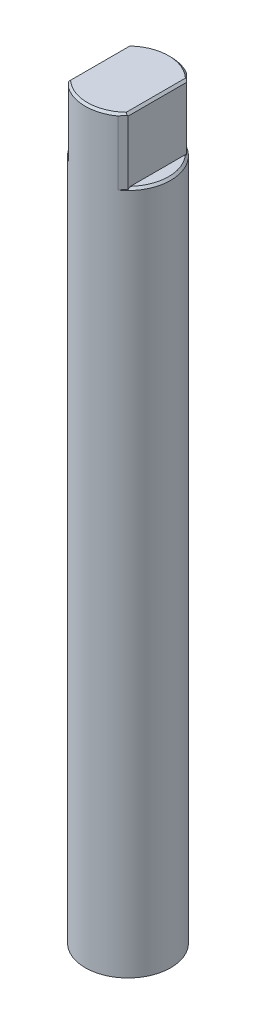
ISO-10303-21;
HEADER;
FILE_DESCRIPTION(('STEP AP214'),'2;1');
FILE_NAME('part.step','',(''),(''),'','','');
FILE_SCHEMA(('AUTOMOTIVE_DESIGN { 1 0 10303 214 1 1 1 1 }'));
ENDSEC;
DATA;
#1=APPLICATION_CONTEXT('core data for automotive mechanical design processes');
#2=APPLICATION_PROTOCOL_DEFINITION('international standard','automotive_design',2000,#1);
#3=PRODUCT_CONTEXT('',#1,'mechanical');
#4=PRODUCT('Part','Part','',(#3));
#5=PRODUCT_RELATED_PRODUCT_CATEGORY('part','',(#4));
#6=PRODUCT_DEFINITION_FORMATION('','',#4);
#7=PRODUCT_DEFINITION_CONTEXT('part definition',#1,'design');
#8=PRODUCT_DEFINITION('design','',#6,#7);
#9=PRODUCT_DEFINITION_SHAPE('','',#8);
#10=(LENGTH_UNIT() NAMED_UNIT(*) SI_UNIT(.MILLI.,.METRE.));
#11=(NAMED_UNIT(*) PLANE_ANGLE_UNIT() SI_UNIT($,.RADIAN.));
#12=(NAMED_UNIT(*) SI_UNIT($,.STERADIAN.) SOLID_ANGLE_UNIT());
#13=UNCERTAINTY_MEASURE_WITH_UNIT(LENGTH_MEASURE(1.E-05),#10,'distance_accuracy_value','');
#14=(GEOMETRIC_REPRESENTATION_CONTEXT(3) GLOBAL_UNCERTAINTY_ASSIGNED_CONTEXT((#13)) GLOBAL_UNIT_ASSIGNED_CONTEXT((#10,
#11,#12)) REPRESENTATION_CONTEXT('',''));
#15=CARTESIAN_POINT('',(0.,0.,0.));
#16=DIRECTION('',(0.,0.,1.));
#17=DIRECTION('',(1.,0.,0.));
#18=AXIS2_PLACEMENT_3D('',#15,#16,#17);
#19=CARTESIAN_POINT('',(0.,175.,0.));
#20=DIRECTION('',(0.,-1.,0.));
#21=DIRECTION('',(0.,0.,-1.));
#22=AXIS2_PLACEMENT_3D('',#19,#20,#21);
#23=CYLINDRICAL_SURFACE('',#22,10.);
#24=DIRECTION('',(0.,-1.,0.));
#25=VECTOR('',#24,1.);
#26=CARTESIAN_POINT('',(-5.78364077806194,175.,8.15778765048092));
#27=LINE('',#26,#25);
#28=CARTESIAN_POINT('',(-5.78364077806194,174.5,8.15778765048092));
#29=VERTEX_POINT('',#28);
#30=CARTESIAN_POINT('',(-5.78364077806194,159.5,8.15778765048092));
#31=VERTEX_POINT('',#30);
#32=EDGE_CURVE('E470',#29,#31,#27,.T.);
#33=ORIENTED_EDGE('',*,*,#32,.T.);
#34=CARTESIAN_POINT('',(0.,159.5,0.));
#35=DIRECTION('',(0.,1.,0.));
#36=DIRECTION('',(0.,0.,1.));
#37=AXIS2_PLACEMENT_3D('',#34,#35,#36);
#38=CIRCLE('',#37,10.);
#39=CARTESIAN_POINT('',(-4.95581271359216,159.5,-8.68561571495068));
#40=VERTEX_POINT('',#39);
#41=EDGE_CURVE('E348',#31,#40,#38,.F.);
#42=ORIENTED_EDGE('',*,*,#41,.T.);
#43=DIRECTION('',(0.,-1.,0.));
#44=VECTOR('',#43,1.);
#45=CARTESIAN_POINT('',(-4.95581271359216,175.,-8.68561571495068));
#46=LINE('',#45,#44);
#47=CARTESIAN_POINT('',(-4.95581271359216,174.5,-8.68561571495068));
#48=VERTEX_POINT('',#47);
#49=EDGE_CURVE('E379',#40,#48,#46,.F.);
#50=ORIENTED_EDGE('',*,*,#49,.T.);
#51=CARTESIAN_POINT('',(0.,174.5,0.));
#52=DIRECTION('',(0.,1.,0.));
#53=DIRECTION('',(0.,0.,1.));
#54=AXIS2_PLACEMENT_3D('',#51,#52,#53);
#55=CIRCLE('',#54,10.);
#56=CARTESIAN_POINT('',(4.95581271359219,174.5,-8.68561571495067));
#57=VERTEX_POINT('',#56);
#58=EDGE_CURVE('E216',#48,#57,#55,.F.);
#59=ORIENTED_EDGE('',*,*,#58,.T.);
#60=DIRECTION('',(0.,-1.,0.));
#61=VECTOR('',#60,1.);
#62=CARTESIAN_POINT('',(4.95581271359219,175.,-8.68561571495066));
#63=LINE('',#62,#61);
#64=CARTESIAN_POINT('',(4.95581271359219,159.5,-8.68561571495066));
#65=VERTEX_POINT('',#64);
#66=EDGE_CURVE('E378',#57,#65,#63,.T.);
#67=ORIENTED_EDGE('',*,*,#66,.T.);
#68=CARTESIAN_POINT('',(0.,159.5,0.));
#69=DIRECTION('',(0.,-1.,0.));
#70=DIRECTION('',(0.,0.,-1.));
#71=AXIS2_PLACEMENT_3D('',#68,#69,#70);
#72=CIRCLE('',#71,10.);
#73=CARTESIAN_POINT('',(5.78364077806188,159.5,8.15778765048096));
#74=VERTEX_POINT('',#73);
#75=EDGE_CURVE('E352',#65,#74,#72,.T.);
#76=ORIENTED_EDGE('',*,*,#75,.T.);
#77=DIRECTION('',(0.,-1.,0.));
#78=VECTOR('',#77,1.);
#79=CARTESIAN_POINT('',(5.78364077806188,175.,8.15778765048096));
#80=LINE('',#79,#78);
#81=CARTESIAN_POINT('',(5.78364077806188,174.5,8.15778765048096));
#82=VERTEX_POINT('',#81);
#83=EDGE_CURVE('E227',#74,#82,#80,.F.);
#84=ORIENTED_EDGE('',*,*,#83,.T.);
#85=CARTESIAN_POINT('',(0.,174.5,0.));
#86=DIRECTION('',(0.,1.,0.));
#87=DIRECTION('',(0.,0.,1.));
#88=AXIS2_PLACEMENT_3D('',#85,#86,#87);
#89=CIRCLE('',#88,10.);
#90=EDGE_CURVE('E212',#82,#29,#89,.F.);
#91=ORIENTED_EDGE('',*,*,#90,.T.);
#92=EDGE_LOOP('',(#33,#42,#50,#59,#67,#76,#84,#91));
#93=FACE_BOUND('',#92,.T.);
#94=CARTESIAN_POINT('',(0.,0.,0.));
#95=DIRECTION('',(0.,1.,0.));
#96=DIRECTION('',(0.,0.,1.));
#97=AXIS2_PLACEMENT_3D('',#94,#95,#96);
#98=CIRCLE('',#97,10.);
#99=CARTESIAN_POINT('',(0.,0.,10.));
#100=VERTEX_POINT('',#99);
#101=EDGE_CURVE('E193',#100,#100,#98,.T.);
#102=ORIENTED_EDGE('',*,*,#101,.T.);
#103=EDGE_LOOP('',(#102));
#104=FACE_BOUND('',#103,.T.);
#105=ADVANCED_FACE('F58',(#93,#104),#23,.T.);
#106=CARTESIAN_POINT('',(0.,175.,0.));
#107=DIRECTION('',(0.,1.,0.));
#108=DIRECTION('',(0.,0.,1.));
#109=AXIS2_PLACEMENT_3D('',#106,#107,#108);
#110=PLANE('',#109);
#111=DIRECTION('',(0.,0.,-1.));
#112=VECTOR('',#111,1.);
#113=CARTESIAN_POINT('',(6.50000000000003,175.,-7.14142842854285));
#114=LINE('',#113,#112);
#115=CARTESIAN_POINT('',(6.50000000000003,175.,6.92820323027552));
#116=VERTEX_POINT('',#115);
#117=CARTESIAN_POINT('',(6.50000000000003,175.,-6.92820323027552));
#118=VERTEX_POINT('',#117);
#119=EDGE_CURVE('E198',#116,#118,#114,.T.);
#120=ORIENTED_EDGE('',*,*,#119,.T.);
#121=CARTESIAN_POINT('',(0.,175.,0.));
#122=DIRECTION('',(0.,1.,0.));
#123=DIRECTION('',(0.,0.,1.));
#124=AXIS2_PLACEMENT_3D('',#121,#122,#123);
#125=CIRCLE('',#124,9.50000000000003);
#126=CARTESIAN_POINT('',(-6.50000000000003,175.,-6.92820323027552));
#127=VERTEX_POINT('',#126);
#128=EDGE_CURVE('E208',#118,#127,#125,.T.);
#129=ORIENTED_EDGE('',*,*,#128,.T.);
#130=DIRECTION('',(0.,0.,1.));
#131=VECTOR('',#130,1.);
#132=CARTESIAN_POINT('',(-6.50000000000003,175.,7.14142842854285));
#133=LINE('',#132,#131);
#134=CARTESIAN_POINT('',(-6.50000000000002,175.,6.92820323027552));
#135=VERTEX_POINT('',#134);
#136=EDGE_CURVE('E204',#127,#135,#133,.T.);
#137=ORIENTED_EDGE('',*,*,#136,.T.);
#138=CARTESIAN_POINT('',(0.,175.,0.));
#139=DIRECTION('',(0.,1.,0.));
#140=DIRECTION('',(0.,0.,1.));
#141=AXIS2_PLACEMENT_3D('',#138,#139,#140);
#142=CIRCLE('',#141,9.50000000000003);
#143=EDGE_CURVE('E201',#135,#116,#142,.T.);
#144=ORIENTED_EDGE('',*,*,#143,.T.);
#145=EDGE_LOOP('',(#120,#129,#137,#144));
#146=FACE_BOUND('',#145,.T.);
#147=ADVANCED_FACE('F429',(#146),#110,.T.);
#148=CARTESIAN_POINT('',(0.,0.,0.));
#149=DIRECTION('',(0.,1.,0.));
#150=DIRECTION('',(0.,0.,1.));
#151=AXIS2_PLACEMENT_3D('',#148,#149,#150);
#152=PLANE('',#151);
#153=CARTESIAN_POINT('',(0.,0.,0.));
#154=DIRECTION('',(0.,-1.,0.));
#155=DIRECTION('',(0.,0.,-1.));
#156=AXIS2_PLACEMENT_3D('',#153,#154,#155);
#157=CIRCLE('',#156,3.39999999999999);
#158=CARTESIAN_POINT('',(0.,0.,-3.39999999999999));
#159=VERTEX_POINT('',#158);
#160=EDGE_CURVE('E180',#159,#159,#157,.T.);
#161=ORIENTED_EDGE('',*,*,#160,.F.);
#162=EDGE_LOOP('',(#161));
#163=FACE_BOUND('',#162,.T.);
#164=ORIENTED_EDGE('',*,*,#101,.F.);
#165=EDGE_LOOP('',(#164));
#166=FACE_BOUND('',#165,.T.);
#167=ADVANCED_FACE('F434',(#163,#166),#152,.F.);
#168=CARTESIAN_POINT('',(0.,160.,0.));
#169=DIRECTION('',(0.,-1.,0.));
#170=DIRECTION('',(0.,0.,-1.));
#171=AXIS2_PLACEMENT_3D('',#168,#169,#170);
#172=PLANE('',#171);
#173=DIRECTION('',(0.,0.,1.));
#174=VECTOR('',#173,1.);
#175=CARTESIAN_POINT('',(7.,160.,-13.4465715280201));
#176=LINE('',#175,#174);
#177=CARTESIAN_POINT('',(7.,160.,-6.42261628933256));
#178=VERTEX_POINT('',#177);
#179=CARTESIAN_POINT('',(7.,160.,6.42261628933256));
#180=VERTEX_POINT('',#179);
#181=EDGE_CURVE('E179',#178,#180,#176,.T.);
#182=ORIENTED_EDGE('',*,*,#181,.T.);
#183=CARTESIAN_POINT('',(0.,160.,0.));
#184=DIRECTION('',(0.,-1.,0.));
#185=DIRECTION('',(0.,0.,-1.));
#186=AXIS2_PLACEMENT_3D('',#183,#184,#185);
#187=CIRCLE('',#186,9.5);
#188=EDGE_CURVE('E345',#180,#178,#187,.F.);
#189=ORIENTED_EDGE('',*,*,#188,.T.);
#190=EDGE_LOOP('',(#182,#189));
#191=FACE_BOUND('',#190,.T.);
#192=ADVANCED_FACE('F439',(#191),#172,.F.);
#193=CARTESIAN_POINT('',(7.,160.,-13.4465715280201));
#194=DIRECTION('',(-1.,0.,0.));
#195=DIRECTION('',(0.,0.,1.));
#196=AXIS2_PLACEMENT_3D('',#193,#194,#195);
#197=PLANE('',#196);
#198=ORIENTED_EDGE('',*,*,#181,.F.);
#199=CARTESIAN_POINT('',(7.,160.,-6.42261628933256));
#200=CARTESIAN_POINT('',(7.,159.975272298558,-6.45918868820734));
#201=CARTESIAN_POINT('',(7.,159.950468589682,-6.49570923319464));
#202=CARTESIAN_POINT('',(7.,159.900709158746,-6.56864661292437));
#203=CARTESIAN_POINT('',(7.,159.875753436697,-6.60506344767382));
#204=CARTESIAN_POINT('',(7.,159.850721707223,-6.64142842854282));
#205=B_SPLINE_CURVE_WITH_KNOTS('',3,(#199,#200,#201,#202,#203,#204),.UNSPECIFIED.,.F.,.F.,(4,2,
4),(0.,0.132441563044288,0.264883117118745),.UNSPECIFIED.);
#206=CARTESIAN_POINT('',(7.,159.850721707223,-6.64142842854282));
#207=VERTEX_POINT('',#206);
#208=EDGE_CURVE('E74',#178,#207,#205,.T.);
#209=ORIENTED_EDGE('',*,*,#208,.T.);
#210=DIRECTION('',(0.,1.,0.));
#211=VECTOR('',#210,1.);
#212=CARTESIAN_POINT('',(7.,160.,-6.64142842854282));
#213=LINE('',#212,#211);
#214=CARTESIAN_POINT('',(7.,174.5,-6.64142842854282));
#215=VERTEX_POINT('',#214);
#216=EDGE_CURVE('E80',#207,#215,#213,.T.);
#217=ORIENTED_EDGE('',*,*,#216,.T.);
#218=DIRECTION('',(0.,0.,1.));
#219=VECTOR('',#218,1.);
#220=CARTESIAN_POINT('',(7.,174.5,7.14142842854285));
#221=LINE('',#220,#219);
#222=CARTESIAN_POINT('',(7.,174.5,6.94142842854284));
#223=VERTEX_POINT('',#222);
#224=EDGE_CURVE('E224',#215,#223,#221,.T.);
#225=ORIENTED_EDGE('',*,*,#224,.T.);
#226=DIRECTION('',(0.,-1.,0.));
#227=VECTOR('',#226,1.);
#228=CARTESIAN_POINT('',(7.,160.,6.94142842854284));
#229=LINE('',#228,#227);
#230=CARTESIAN_POINT('',(7.,159.641834418687,6.94142842854284));
#231=VERTEX_POINT('',#230);
#232=EDGE_CURVE('E88',#223,#231,#229,.T.);
#233=ORIENTED_EDGE('',*,*,#232,.T.);
#234=CARTESIAN_POINT('',(7.,159.641834418687,6.94142842854284));
#235=CARTESIAN_POINT('',(7.,159.702350130539,6.85552688455556));
#236=CARTESIAN_POINT('',(7.,159.76245510595,6.76934178579844));
#237=CARTESIAN_POINT('',(7.,159.88184363374,6.59640440653526));
#238=CARTESIAN_POINT('',(7.,159.941127185433,6.50965212555563));
#239=CARTESIAN_POINT('',(7.,160.,6.42261628933256));
#240=B_SPLINE_CURVE_WITH_KNOTS('',3,(#234,#235,#236,#237,#238,#239),.UNSPECIFIED.,.F.,.F.,(4,2,
4),(0.,0.315221055534513,0.630442374307507),.UNSPECIFIED.);
#241=EDGE_CURVE('E453',#231,#180,#240,.T.);
#242=ORIENTED_EDGE('',*,*,#241,.T.);
#243=EDGE_LOOP('',(#198,#209,#217,#225,#233,#242));
#244=FACE_BOUND('',#243,.T.);
#245=ADVANCED_FACE('F333',(#244),#197,.F.);
#246=CARTESIAN_POINT('',(0.,160.,0.));
#247=DIRECTION('',(0.,1.,0.));
#248=DIRECTION('',(0.,0.,1.));
#249=AXIS2_PLACEMENT_3D('',#246,#247,#248);
#250=PLANE('',#249);
#251=DIRECTION('',(0.,0.,-1.));
#252=VECTOR('',#251,1.);
#253=CARTESIAN_POINT('',(-7.,160.,-13.4465715280201));
#254=LINE('',#253,#252);
#255=CARTESIAN_POINT('',(-7.,160.,6.42261628933252));
#256=VERTEX_POINT('',#255);
#257=CARTESIAN_POINT('',(-7.,160.,-6.42261628933252));
#258=VERTEX_POINT('',#257);
#259=EDGE_CURVE('E185',#256,#258,#254,.T.);
#260=ORIENTED_EDGE('',*,*,#259,.T.);
#261=CARTESIAN_POINT('',(0.,160.,0.));
#262=DIRECTION('',(0.,1.,0.));
#263=DIRECTION('',(0.,0.,1.));
#264=AXIS2_PLACEMENT_3D('',#261,#262,#263);
#265=CIRCLE('',#264,9.49999999999997);
#266=EDGE_CURVE('E356',#258,#256,#265,.T.);
#267=ORIENTED_EDGE('',*,*,#266,.T.);
#268=EDGE_LOOP('',(#260,#267));
#269=FACE_BOUND('',#268,.T.);
#270=ADVANCED_FACE('F331',(#269),#250,.T.);
#271=CARTESIAN_POINT('',(-7.,160.,-13.4465715280201));
#272=DIRECTION('',(1.,0.,0.));
#273=DIRECTION('',(0.,0.,-1.));
#274=AXIS2_PLACEMENT_3D('',#271,#272,#273);
#275=PLANE('',#274);
#276=DIRECTION('',(0.,0.,-1.));
#277=VECTOR('',#276,1.);
#278=CARTESIAN_POINT('',(-7.,174.5,-7.14142842854285));
#279=LINE('',#278,#277);
#280=CARTESIAN_POINT('',(-7.,174.5,6.94142842854286));
#281=VERTEX_POINT('',#280);
#282=CARTESIAN_POINT('',(-7.,174.5,-6.64142842854284));
#283=VERTEX_POINT('',#282);
#284=EDGE_CURVE('E220',#281,#283,#279,.T.);
#285=ORIENTED_EDGE('',*,*,#284,.T.);
#286=DIRECTION('',(0.,-1.,0.));
#287=VECTOR('',#286,1.);
#288=CARTESIAN_POINT('',(-7.,160.,-6.64142842854284));
#289=LINE('',#288,#287);
#290=CARTESIAN_POINT('',(-7.,159.850721707223,-6.64142842854284));
#291=VERTEX_POINT('',#290);
#292=EDGE_CURVE('E360',#283,#291,#289,.T.);
#293=ORIENTED_EDGE('',*,*,#292,.T.);
#294=CARTESIAN_POINT('',(-7.,159.850721707223,-6.64142842854284));
#295=CARTESIAN_POINT('',(-7.,159.875753436697,-6.60506344767382));
#296=CARTESIAN_POINT('',(-7.,159.900709158746,-6.56864661292436));
#297=CARTESIAN_POINT('',(-7.,159.950468589682,-6.49570923319461));
#298=CARTESIAN_POINT('',(-7.,159.975272298558,-6.45918868820731));
#299=CARTESIAN_POINT('',(-7.,160.,-6.42261628933253));
#300=B_SPLINE_CURVE_WITH_KNOTS('',3,(#294,#295,#296,#297,#298,#299),.UNSPECIFIED.,.F.,.F.,(4,2,
4),(0.,0.132441554074486,0.264883117118803),.UNSPECIFIED.);
#301=EDGE_CURVE('E306',#291,#258,#300,.T.);
#302=ORIENTED_EDGE('',*,*,#301,.T.);
#303=ORIENTED_EDGE('',*,*,#259,.F.);
#304=CARTESIAN_POINT('',(-7.,160.,6.42261628933252));
#305=CARTESIAN_POINT('',(-7.,159.941127185433,6.5096521255556));
#306=CARTESIAN_POINT('',(-7.,159.88184363374,6.59640440653524));
#307=CARTESIAN_POINT('',(-7.,159.76245510595,6.76934178579843));
#308=CARTESIAN_POINT('',(-7.,159.702350130539,6.85552688455556));
#309=CARTESIAN_POINT('',(-7.,159.641834418687,6.94142842854285));
#310=B_SPLINE_CURVE_WITH_KNOTS('',3,(#304,#305,#306,#307,#308,#309),.UNSPECIFIED.,.F.,.F.,(4,2,
4),(0.,0.315221318773009,0.630442374307544),.UNSPECIFIED.);
#311=CARTESIAN_POINT('',(-7.,159.641834418687,6.94142842854286));
#312=VERTEX_POINT('',#311);
#313=EDGE_CURVE('E337',#256,#312,#310,.T.);
#314=ORIENTED_EDGE('',*,*,#313,.T.);
#315=DIRECTION('',(0.,1.,0.));
#316=VECTOR('',#315,1.);
#317=CARTESIAN_POINT('',(-7.,160.,6.94142842854286));
#318=LINE('',#317,#316);
#319=EDGE_CURVE('E485',#312,#281,#318,.T.);
#320=ORIENTED_EDGE('',*,*,#319,.T.);
#321=EDGE_LOOP('',(#285,#293,#302,#303,#314,#320));
#322=FACE_BOUND('',#321,.T.);
#323=ADVANCED_FACE('F172',(#322),#275,.F.);
#324=CARTESIAN_POINT('',(0.,12.,0.));
#325=DIRECTION('',(0.,-1.,0.));
#326=DIRECTION('',(0.,0.,-1.));
#327=AXIS2_PLACEMENT_3D('',#324,#325,#326);
#328=CONICAL_SURFACE('',#327,3.4,1.02974425867665);
#329=CARTESIAN_POINT('',(0.,14.0429261046937,0.));
#330=VERTEX_POINT('',#329);
#331=VERTEX_LOOP('',#330);
#332=FACE_BOUND('',#331,.T.);
#333=CARTESIAN_POINT('',(0.,12.,0.));
#334=DIRECTION('',(0.,-1.,0.));
#335=DIRECTION('',(0.,0.,-1.));
#336=AXIS2_PLACEMENT_3D('',#333,#334,#335);
#337=CIRCLE('',#336,3.4);
#338=CARTESIAN_POINT('',(0.,12.,-3.4));
#339=VERTEX_POINT('',#338);
#340=EDGE_CURVE('E176',#339,#339,#337,.T.);
#341=ORIENTED_EDGE('',*,*,#340,.T.);
#342=EDGE_LOOP('',(#341));
#343=FACE_BOUND('',#342,.T.);
#344=ADVANCED_FACE('F168',(#332,#343),#328,.F.);
#345=CARTESIAN_POINT('',(0.,0.,0.));
#346=DIRECTION('',(0.,-1.,0.));
#347=DIRECTION('',(0.,0.,-1.));
#348=AXIS2_PLACEMENT_3D('',#345,#346,#347);
#349=CYLINDRICAL_SURFACE('',#348,3.39999999999999);
#350=ORIENTED_EDGE('',*,*,#340,.F.);
#351=EDGE_LOOP('',(#350));
#352=FACE_BOUND('',#351,.T.);
#353=ORIENTED_EDGE('',*,*,#160,.T.);
#354=EDGE_LOOP('',(#353));
#355=FACE_BOUND('',#354,.T.);
#356=ADVANCED_FACE('F171',(#352,#355),#349,.F.);
#357=CARTESIAN_POINT('',(0.,175.,0.));
#358=DIRECTION('',(0.,-1.,0.));
#359=DIRECTION('',(0.,0.,-1.));
#360=AXIS2_PLACEMENT_3D('',#357,#358,#359);
#361=CONICAL_SURFACE('',#360,9.50000000000003,0.785398163397448);
#362=CARTESIAN_POINT('',(-6.50000000000003,175.,6.92820323027552));
#363=CARTESIAN_POINT('',(-6.58322808259572,174.916771917404,6.96423442431751));
#364=CARTESIAN_POINT('',(-6.66650879525313,174.833491204747,7.00001878983178));
#365=CARTESIAN_POINT('',(-6.83317546194347,174.666824538057,7.07109385580983));
#366=CARTESIAN_POINT('',(-6.91656141595271,174.583438584047,7.10638455638467));
#367=CARTESIAN_POINT('',(-6.99999999999999,174.5,7.14142842854286));
#368=B_SPLINE_CURVE_WITH_KNOTS('',3,(#362,#363,#364,#365,#366,#367),.UNSPECIFIED.,.F.,.F.,(4,2,
4),(0.,0.369278858249981,0.738557633421447),.UNSPECIFIED.);
#369=CARTESIAN_POINT('',(-6.85933685133245,174.640663148668,7.08209157721041));
#370=VERTEX_POINT('',#369);
#371=EDGE_CURVE('E478',#370,#135,#368,.F.);
#372=ORIENTED_EDGE('',*,*,#371,.F.);
#373=CARTESIAN_POINT('',(-6.85933685133245,174.640663148668,7.08209157721041));
#374=CARTESIAN_POINT('',(-6.76917249945658,174.63863444595,7.17225592908628));
#375=CARTESIAN_POINT('',(-6.67903808430889,174.634116599193,7.26239034423397));
#376=CARTESIAN_POINT('',(-6.49908588435474,174.620197276968,7.44234254418812));
#377=CARTESIAN_POINT('',(-6.40926783178822,174.610802736667,7.53216059675464));
#378=CARTESIAN_POINT('',(-6.22995178782874,174.587218856601,7.71147664071412));
#379=CARTESIAN_POINT('',(-6.14045378529683,174.573029685382,7.80097464324604));
#380=CARTESIAN_POINT('',(-5.9617599225051,174.539982742084,7.97966850603776));
#381=CARTESIAN_POINT('',(-5.87256467191812,174.521118367814,8.06886375662475));
#382=CARTESIAN_POINT('',(-5.78364077806194,174.5,8.15778765048092));
#383=B_SPLINE_CURVE_WITH_KNOTS('',3,(#373,#374,#375,#376,#377,#378,#379,#380,#381,#382),
.UNSPECIFIED.,.F.,.F.,(4,2,2,2,4),(0.,0.382555346665905,0.76456814407418,1.14656751401599,
1.5291094377485),.UNSPECIFIED.);
#384=EDGE_CURVE('E394',#370,#29,#383,.T.);
#385=ORIENTED_EDGE('',*,*,#384,.T.);
#386=ORIENTED_EDGE('',*,*,#90,.F.);
#387=CARTESIAN_POINT('',(5.78364077806188,174.5,8.15778765048096));
#388=CARTESIAN_POINT('',(5.87256467191806,174.521118367814,8.06886375662479));
#389=CARTESIAN_POINT('',(5.96175992250505,174.539982742084,7.9796685060378));
#390=CARTESIAN_POINT('',(6.14045378529678,174.573029685381,7.80097464324606));
#391=CARTESIAN_POINT('',(6.22995178782869,174.587218856601,7.71147664071415));
#392=CARTESIAN_POINT('',(6.40926783178819,174.610802736667,7.53216059675465));
#393=CARTESIAN_POINT('',(6.49908588435471,174.620197276968,7.44234254418813));
#394=CARTESIAN_POINT('',(6.67903808430887,174.634116599193,7.26239034423397));
#395=CARTESIAN_POINT('',(6.76917249945657,174.63863444595,7.17225592908627));
#396=CARTESIAN_POINT('',(6.85933685133243,174.640663148668,7.08209157721041));
#397=B_SPLINE_CURVE_WITH_KNOTS('',3,(#387,#388,#389,#390,#391,#392,#393,#394,#395,#396),
.UNSPECIFIED.,.F.,.F.,(4,2,2,2,4),(0.,0.382541923732531,0.764541293674354,1.14655409108265,
1.52910943774857),.UNSPECIFIED.);
#398=CARTESIAN_POINT('',(6.85933685133243,174.640663148668,7.0820915772104));
#399=VERTEX_POINT('',#398);
#400=EDGE_CURVE('E401',#82,#399,#397,.T.);
#401=ORIENTED_EDGE('',*,*,#400,.T.);
#402=CARTESIAN_POINT('',(6.50000000000003,175.,6.92820323027552));
#403=CARTESIAN_POINT('',(6.58322808259572,174.916771917404,6.96423442431751));
#404=CARTESIAN_POINT('',(6.66650879525313,174.833491204747,7.00001878983178));
#405=CARTESIAN_POINT('',(6.83317546194347,174.666824538057,7.07109385580983));
#406=CARTESIAN_POINT('',(6.91656141595271,174.583438584047,7.10638455638467));
#407=CARTESIAN_POINT('',(7.,174.5,7.14142842854285));
#408=B_SPLINE_CURVE_WITH_KNOTS('',3,(#402,#403,#404,#405,#406,#407),.UNSPECIFIED.,.F.,.F.,(4,2,
4),(0.,0.369278858249982,0.738557633421448),.UNSPECIFIED.);
#409=EDGE_CURVE('E188',#116,#399,#408,.T.);
#410=ORIENTED_EDGE('',*,*,#409,.F.);
#411=ORIENTED_EDGE('',*,*,#143,.F.);
#412=EDGE_LOOP('',(#372,#385,#386,#401,#410,#411));
#413=FACE_BOUND('',#412,.T.);
#414=ADVANCED_FACE('F408',(#413),#361,.T.);
#415=CARTESIAN_POINT('',(7.,174.5,-13.4465715280201));
#416=DIRECTION('',(0.707106781186548,0.707106781186547,0.));
#417=DIRECTION('',(0.,0.,-1.));
#418=AXIS2_PLACEMENT_3D('',#415,#416,#417);
#419=PLANE('',#418);
#420=ORIENTED_EDGE('',*,*,#224,.F.);
#421=DIRECTION('',(0.577350269189622,-0.577350269189623,0.577350269189632));
#422=VECTOR('',#421,1.);
#423=CARTESIAN_POINT('',(4.7316189668409,176.768381033159,-8.90980946170197));
#424=LINE('',#423,#422);
#425=CARTESIAN_POINT('',(6.64900276851127,174.850997231489,-6.99242566003154));
#426=VERTEX_POINT('',#425);
#427=EDGE_CURVE('E274',#215,#426,#424,.F.);
#428=ORIENTED_EDGE('',*,*,#427,.T.);
#429=CARTESIAN_POINT('',(7.,174.5,-7.14142842854285));
#430=CARTESIAN_POINT('',(6.91656141595272,174.583438584047,-7.10638455638467));
#431=CARTESIAN_POINT('',(6.83317546194347,174.666824538057,-7.07109385580983));
#432=CARTESIAN_POINT('',(6.66650879525313,174.833491204747,-7.00001878983178));
#433=CARTESIAN_POINT('',(6.58322808259572,174.916771917404,-6.96423442431751));
#434=CARTESIAN_POINT('',(6.50000000000003,175.,-6.92820323027553));
#435=B_SPLINE_CURVE_WITH_KNOTS('',3,(#429,#430,#431,#432,#433,#434),.UNSPECIFIED.,.F.,.F.,(4,2,
4),(0.,0.369278775171467,0.738557633421445),.UNSPECIFIED.);
#436=EDGE_CURVE('E237',#118,#426,#435,.F.);
#437=ORIENTED_EDGE('',*,*,#436,.F.);
#438=ORIENTED_EDGE('',*,*,#119,.F.);
#439=ORIENTED_EDGE('',*,*,#409,.T.);
#440=DIRECTION('',(0.577350269189625,-0.577350269189626,-0.577350269189627));
#441=VECTOR('',#440,1.);
#442=CARTESIAN_POINT('',(13.795999985521,167.704000014479,0.145428443021839));
#443=LINE('',#442,#441);
#444=EDGE_CURVE('E390',#399,#223,#443,.T.);
#445=ORIENTED_EDGE('',*,*,#444,.T.);
#446=EDGE_LOOP('',(#420,#428,#437,#438,#439,#445));
#447=FACE_BOUND('',#446,.T.);
#448=ADVANCED_FACE('F257',(#447),#419,.T.);
#449=CARTESIAN_POINT('',(-7.,174.5,-13.4465715280201));
#450=DIRECTION('',(-0.707106781186548,0.707106781186547,0.));
#451=DIRECTION('',(0.,0.,1.));
#452=AXIS2_PLACEMENT_3D('',#449,#450,#451);
#453=PLANE('',#452);
#454=CARTESIAN_POINT('',(-6.50000000000003,175.,-6.92820323027552));
#455=CARTESIAN_POINT('',(-6.58322808259572,174.916771917404,-6.96423442431751));
#456=CARTESIAN_POINT('',(-6.66650879525313,174.833491204747,-7.00001878983178));
#457=CARTESIAN_POINT('',(-6.83317546194347,174.666824538057,-7.07109385580983));
#458=CARTESIAN_POINT('',(-6.91656141595271,174.583438584047,-7.10638455638467));
#459=CARTESIAN_POINT('',(-7.,174.5,-7.14142842854285));
#460=B_SPLINE_CURVE_WITH_KNOTS('',3,(#454,#455,#456,#457,#458,#459),.UNSPECIFIED.,.F.,.F.,(4,2,
4),(0.,0.369278858249983,0.738557633421449),.UNSPECIFIED.);
#461=CARTESIAN_POINT('',(-6.64900276851128,174.850997231489,-6.99242566003155));
#462=VERTEX_POINT('',#461);
#463=EDGE_CURVE('E228',#462,#127,#460,.F.);
#464=ORIENTED_EDGE('',*,*,#463,.F.);
#465=DIRECTION('',(-0.577350269189625,-0.577350269189625,0.577350269189627));
#466=VECTOR('',#465,1.);
#467=CARTESIAN_POINT('',(-4.73161896684091,176.768381033159,-8.90980946170193));
#468=LINE('',#467,#466);
#469=EDGE_CURVE('E362',#462,#283,#468,.T.);
#470=ORIENTED_EDGE('',*,*,#469,.T.);
#471=ORIENTED_EDGE('',*,*,#284,.F.);
#472=DIRECTION('',(-0.577350269189625,-0.577350269189625,-0.577350269189627));
#473=VECTOR('',#472,1.);
#474=CARTESIAN_POINT('',(-13.795999985521,167.704000014479,0.145428443021853));
#475=LINE('',#474,#473);
#476=EDGE_CURVE('E480',#281,#370,#475,.F.);
#477=ORIENTED_EDGE('',*,*,#476,.T.);
#478=ORIENTED_EDGE('',*,*,#371,.T.);
#479=ORIENTED_EDGE('',*,*,#136,.F.);
#480=EDGE_LOOP('',(#464,#470,#471,#477,#478,#479));
#481=FACE_BOUND('',#480,.T.);
#482=ADVANCED_FACE('F245',(#481),#453,.T.);
#483=CARTESIAN_POINT('',(0.,175.,0.));
#484=DIRECTION('',(0.,-1.,0.));
#485=DIRECTION('',(0.,0.,-1.));
#486=AXIS2_PLACEMENT_3D('',#483,#484,#485);
#487=CONICAL_SURFACE('',#486,9.50000000000003,0.785398163397448);
#488=ORIENTED_EDGE('',*,*,#436,.T.);
#489=CARTESIAN_POINT('',(6.64900276851127,174.850997231489,-6.99242566003155));
#490=CARTESIAN_POINT('',(6.50584170962432,174.845955528815,-7.13558671891851));
#491=CARTESIAN_POINT('',(6.36281538707122,174.834443672025,-7.27861304147161));
#492=CARTESIAN_POINT('',(6.07801494220257,174.799090248319,-7.56341348634027));
#493=CARTESIAN_POINT('',(5.93623821270722,174.775290873095,-7.70519021583562));
#494=CARTESIAN_POINT('',(5.65396634085822,174.715937306678,-7.98746208768462));
#495=CARTESIAN_POINT('',(5.5134709318887,174.680385621015,-8.12795749665415));
#496=CARTESIAN_POINT('',(5.23359324265483,174.598259792416,-8.40783518588802));
#497=CARTESIAN_POINT('',(5.09421641990839,174.551648330431,-8.54721200863447));
#498=CARTESIAN_POINT('',(4.95581271359219,174.5,-8.68561571495067));
#499=B_SPLINE_CURVE_WITH_KNOTS('',3,(#489,#490,#491,#492,#493,#494,#495,#496,#497,#498),
.UNSPECIFIED.,.F.,.F.,(4,2,2,2,4),(0.,0.607425421102798,1.21277885971251,1.81800332329518,
2.42529979210586),.UNSPECIFIED.);
#500=EDGE_CURVE('E273',#426,#57,#499,.T.);
#501=ORIENTED_EDGE('',*,*,#500,.T.);
#502=ORIENTED_EDGE('',*,*,#58,.F.);
#503=CARTESIAN_POINT('',(-4.95581271359216,174.5,-8.68561571495068));
#504=CARTESIAN_POINT('',(-5.09421641990836,174.551648330431,-8.54721200863448));
#505=CARTESIAN_POINT('',(-5.23359324265481,174.598259792416,-8.40783518588804));
#506=CARTESIAN_POINT('',(-5.51347093188868,174.680385621015,-8.12795749665416));
#507=CARTESIAN_POINT('',(-5.65396634085821,174.715937306678,-7.98746208768463));
#508=CARTESIAN_POINT('',(-5.93623821270721,174.775290873095,-7.70519021583563));
#509=CARTESIAN_POINT('',(-6.07801494220257,174.799090248319,-7.56341348634028));
#510=CARTESIAN_POINT('',(-6.36281538707122,174.834443672025,-7.27861304147162));
#511=CARTESIAN_POINT('',(-6.50584170962433,174.845955528815,-7.13558671891851));
#512=CARTESIAN_POINT('',(-6.64900276851129,174.850997231489,-6.99242566003155));
#513=B_SPLINE_CURVE_WITH_KNOTS('',3,(#503,#504,#505,#506,#507,#508,#509,#510,#511,#512),
.UNSPECIFIED.,.F.,.F.,(4,2,2,2,4),(0.,0.607296468810696,1.21252093239337,1.8178743710031,
2.4252997921059),.UNSPECIFIED.);
#514=EDGE_CURVE('E265',#48,#462,#513,.T.);
#515=ORIENTED_EDGE('',*,*,#514,.T.);
#516=ORIENTED_EDGE('',*,*,#463,.T.);
#517=ORIENTED_EDGE('',*,*,#128,.F.);
#518=EDGE_LOOP('',(#488,#501,#502,#515,#516,#517));
#519=FACE_BOUND('',#518,.T.);
#520=ADVANCED_FACE('F249',(#519),#487,.T.);
#521=CARTESIAN_POINT('',(-5.78364077806195,175.,8.15778765048092));
#522=DIRECTION('',(0.707106781186548,0.,-0.707106781186547));
#523=DIRECTION('',(0.,-1.,0.));
#524=AXIS2_PLACEMENT_3D('',#521,#522,#523);
#525=PLANE('',#524);
#526=ORIENTED_EDGE('',*,*,#476,.F.);
#527=ORIENTED_EDGE('',*,*,#319,.F.);
#528=CARTESIAN_POINT('',(-7.,159.641834418687,6.94142842854286));
#529=CARTESIAN_POINT('',(-6.89807259427126,159.642454048488,7.0433558342716));
#530=CARTESIAN_POINT('',(-6.79613792351102,159.639884187043,7.14529050503184));
#531=CARTESIAN_POINT('',(-6.59263030357723,159.628473217197,7.34879812496563));
#532=CARTESIAN_POINT('',(-6.49105703378397,159.61964357197,7.45037139475889));
#533=CARTESIAN_POINT('',(-6.28827937016395,159.595822847372,7.65314905837891));
#534=CARTESIAN_POINT('',(-6.187074959682,159.580832049764,7.75435346886087));
#535=CARTESIAN_POINT('',(-5.98501051005904,159.544862880554,7.95641791848382));
#536=CARTESIAN_POINT('',(-5.8841514400228,159.523873602047,8.05727698852006));
#537=CARTESIAN_POINT('',(-5.78364077806194,159.5,8.15778765048092));
#538=B_SPLINE_CURVE_WITH_KNOTS('',3,(#528,#529,#530,#531,#532,#533,#534,#535,#536,#537),
.UNSPECIFIED.,.F.,.F.,(4,2,2,2,4),(0.,0.432405541425507,0.864021282583851,1.2956172872758,
1.72800310164515),.UNSPECIFIED.);
#539=EDGE_CURVE('E307',#312,#31,#538,.T.);
#540=ORIENTED_EDGE('',*,*,#539,.T.);
#541=ORIENTED_EDGE('',*,*,#32,.F.);
#542=ORIENTED_EDGE('',*,*,#384,.F.);
#543=EDGE_LOOP('',(#526,#527,#540,#541,#542));
#544=FACE_BOUND('',#543,.T.);
#545=ADVANCED_FACE('F255',(#544),#525,.F.);
#546=CARTESIAN_POINT('',(5.78364077806188,175.,8.15778765048097));
#547=DIRECTION('',(0.707106781186549,0.,0.707106781186546));
#548=DIRECTION('',(0.,-1.,0.));
#549=AXIS2_PLACEMENT_3D('',#546,#547,#548);
#550=PLANE('',#549);
#551=ORIENTED_EDGE('',*,*,#83,.F.);
#552=CARTESIAN_POINT('',(5.78364077806188,159.5,8.15778765048096));
#553=CARTESIAN_POINT('',(5.88415144002275,159.523873602047,8.0572769885201));
#554=CARTESIAN_POINT('',(5.98501051005899,159.544862880554,7.95641791848386));
#555=CARTESIAN_POINT('',(6.18707495968195,159.580832049764,7.75435346886089));
#556=CARTESIAN_POINT('',(6.28827937016391,159.595822847373,7.65314905837893));
#557=CARTESIAN_POINT('',(6.49105703378395,159.61964357197,7.4503713947589));
#558=CARTESIAN_POINT('',(6.59263030357721,159.628473217197,7.34879812496563));
#559=CARTESIAN_POINT('',(6.79613792351101,159.639884187043,7.14529050503184));
#560=CARTESIAN_POINT('',(6.89807259427125,159.642454048488,7.04335583427159));
#561=CARTESIAN_POINT('',(6.99999999999999,159.641834418687,6.94142842854285));
#562=B_SPLINE_CURVE_WITH_KNOTS('',3,(#552,#553,#554,#555,#556,#557,#558,#559,#560,#561),
.UNSPECIFIED.,.F.,.F.,(4,2,2,2,4),(0.,0.432385814369366,0.863981819061345,1.29559756021971,
1.72800310164524),.UNSPECIFIED.);
#563=EDGE_CURVE('E321',#74,#231,#562,.T.);
#564=ORIENTED_EDGE('',*,*,#563,.T.);
#565=ORIENTED_EDGE('',*,*,#232,.F.);
#566=ORIENTED_EDGE('',*,*,#444,.F.);
#567=ORIENTED_EDGE('',*,*,#400,.F.);
#568=EDGE_LOOP('',(#551,#564,#565,#566,#567));
#569=FACE_BOUND('',#568,.T.);
#570=ADVANCED_FACE('F416',(#569),#550,.T.);
#571=CARTESIAN_POINT('',(4.9558127135922,175.,-8.68561571495066));
#572=DIRECTION('',(-0.707106781186554,0.,0.707106781186542));
#573=DIRECTION('',(0.,-1.,0.));
#574=AXIS2_PLACEMENT_3D('',#571,#572,#573);
#575=PLANE('',#574);
#576=ORIENTED_EDGE('',*,*,#427,.F.);
#577=ORIENTED_EDGE('',*,*,#216,.F.);
#578=CARTESIAN_POINT('',(7.,159.850721707223,-6.64142842854282));
#579=CARTESIAN_POINT('',(6.91369346278648,159.85393448168,-6.72773496575635));
#580=CARTESIAN_POINT('',(6.82735127685333,159.854822309418,-6.81407715168949));
#581=CARTESIAN_POINT('',(6.65470886806129,159.851968117261,-6.98671956048154));
#582=CARTESIAN_POINT('',(6.56840864353348,159.848226299691,-7.07301978500935));
#583=CARTESIAN_POINT('',(6.3106378315048,159.830150259132,-7.33079059703803));
#584=CARTESIAN_POINT('',(6.1393856329219,159.808998613543,-7.50204279562094));
#585=CARTESIAN_POINT('',(5.79848624407772,159.749258948873,-7.84294218446512));
#586=CARTESIAN_POINT('',(5.62883855603404,159.710676531624,-8.0125898725088));
#587=CARTESIAN_POINT('',(5.37563298070172,159.640639983758,-8.26579544784113));
#588=CARTESIAN_POINT('',(5.29122109751604,159.615183936569,-8.35020733102682));
#589=CARTESIAN_POINT('',(5.12303139526228,159.560425324173,-8.51839703328058));
#590=CARTESIAN_POINT('',(5.03925351524876,159.531123133785,-8.60217491329409));
#591=CARTESIAN_POINT('',(4.95581271359219,159.5,-8.68561571495066));
#592=B_SPLINE_CURVE_WITH_KNOTS('',3,(#578,#579,#580,#581,#582,#583,#584,#585,#586,#587,#588,
#589,#590,#591),.UNSPECIFIED.,.F.,.F.,(4,2,2,2,2,2,4),(0.,0.36625120895022,0.732486412682951,
1.46109864001059,2.18947687523752,2.55560307279642,2.92169361654454),.UNSPECIFIED.);
#593=EDGE_CURVE('E11',#207,#65,#592,.T.);
#594=ORIENTED_EDGE('',*,*,#593,.T.);
#595=ORIENTED_EDGE('',*,*,#66,.F.);
#596=ORIENTED_EDGE('',*,*,#500,.F.);
#597=EDGE_LOOP('',(#576,#577,#594,#595,#596));
#598=FACE_BOUND('',#597,.T.);
#599=ADVANCED_FACE('F290',(#598),#575,.F.);
#600=CARTESIAN_POINT('',(-4.95581271359216,175.,-8.68561571495068));
#601=DIRECTION('',(-0.707106781186548,0.,-0.707106781186546));
#602=DIRECTION('',(0.,-1.,0.));
#603=AXIS2_PLACEMENT_3D('',#600,#601,#602);
#604=PLANE('',#603);
#605=ORIENTED_EDGE('',*,*,#49,.F.);
#606=CARTESIAN_POINT('',(-4.95581271359216,159.5,-8.68561571495068));
#607=CARTESIAN_POINT('',(-5.03925351524873,159.531123133785,-8.60217491329411));
#608=CARTESIAN_POINT('',(-5.12303139526225,159.560425324173,-8.51839703328059));
#609=CARTESIAN_POINT('',(-5.29122109751602,159.615183936569,-8.35020733102683));
#610=CARTESIAN_POINT('',(-5.3756329807017,159.640639983758,-8.26579544784114));
#611=CARTESIAN_POINT('',(-5.62883855603403,159.710676531624,-8.01258987250882));
#612=CARTESIAN_POINT('',(-5.79848624407771,159.749258948873,-7.84294218446514));
#613=CARTESIAN_POINT('',(-6.13938563292189,159.808998613543,-7.50204279562096));
#614=CARTESIAN_POINT('',(-6.31063783150479,159.830150259132,-7.33079059703805));
#615=CARTESIAN_POINT('',(-6.56840864353348,159.848226299691,-7.07301978500936));
#616=CARTESIAN_POINT('',(-6.65470886806128,159.851968117261,-6.98671956048156));
#617=CARTESIAN_POINT('',(-6.82735127685333,159.854822309418,-6.81407715168951));
#618=CARTESIAN_POINT('',(-6.91369346278648,159.85393448168,-6.72773496575636));
#619=CARTESIAN_POINT('',(-7.,159.850721707223,-6.64142842854284));
#620=B_SPLINE_CURVE_WITH_KNOTS('',3,(#606,#607,#608,#609,#610,#611,#612,#613,#614,#615,#616,
#617,#618,#619),.UNSPECIFIED.,.F.,.F.,(4,2,2,2,2,2,4),(0.,0.366090543748132,0.73221674130704,
1.46059497653397,2.18920720386161,2.55544240759435,2.92169361654457),.UNSPECIFIED.);
#621=EDGE_CURVE('E297',#40,#291,#620,.T.);
#622=ORIENTED_EDGE('',*,*,#621,.T.);
#623=ORIENTED_EDGE('',*,*,#292,.F.);
#624=ORIENTED_EDGE('',*,*,#469,.F.);
#625=ORIENTED_EDGE('',*,*,#514,.F.);
#626=EDGE_LOOP('',(#605,#622,#623,#624,#625));
#627=FACE_BOUND('',#626,.T.);
#628=ADVANCED_FACE('F282',(#627),#604,.T.);
#629=CARTESIAN_POINT('',(0.,160.,0.));
#630=DIRECTION('',(0.,-1.,0.));
#631=DIRECTION('',(0.,0.,-1.));
#632=AXIS2_PLACEMENT_3D('',#629,#630,#631);
#633=CONICAL_SURFACE('',#632,9.49999999999997,0.785398163397474);
#634=ORIENTED_EDGE('',*,*,#621,.F.);
#635=ORIENTED_EDGE('',*,*,#41,.F.);
#636=ORIENTED_EDGE('',*,*,#539,.F.);
#637=ORIENTED_EDGE('',*,*,#313,.F.);
#638=ORIENTED_EDGE('',*,*,#266,.F.);
#639=ORIENTED_EDGE('',*,*,#301,.F.);
#640=EDGE_LOOP('',(#634,#635,#636,#637,#638,#639));
#641=FACE_BOUND('',#640,.T.);
#642=ADVANCED_FACE('F289',(#641),#633,.T.);
#643=CARTESIAN_POINT('',(0.,159.5,0.));
#644=DIRECTION('',(0.,-1.,0.));
#645=DIRECTION('',(0.,0.,-1.));
#646=AXIS2_PLACEMENT_3D('',#643,#644,#645);
#647=CONICAL_SURFACE('',#646,10.,0.785398163397448);
#648=ORIENTED_EDGE('',*,*,#208,.F.);
#649=ORIENTED_EDGE('',*,*,#188,.F.);
#650=ORIENTED_EDGE('',*,*,#241,.F.);
#651=ORIENTED_EDGE('',*,*,#563,.F.);
#652=ORIENTED_EDGE('',*,*,#75,.F.);
#653=ORIENTED_EDGE('',*,*,#593,.F.);
#654=EDGE_LOOP('',(#648,#649,#650,#651,#652,#653));
#655=FACE_BOUND('',#654,.T.);
#656=ADVANCED_FACE('F61',(#655),#647,.T.);
#657=CLOSED_SHELL('',(#105,#147,#167,#192,#245,#270,#323,#344,#356,#414,#448,#482,#520,#545,
#570,#599,#628,#642,#656));
#658=MANIFOLD_SOLID_BREP('B2',#657);
#659=ADVANCED_BREP_SHAPE_REPRESENTATION('',(#18,#658),#14);
#660=SHAPE_DEFINITION_REPRESENTATION(#9,#659);
ENDSEC;
END-ISO-10303-21;
